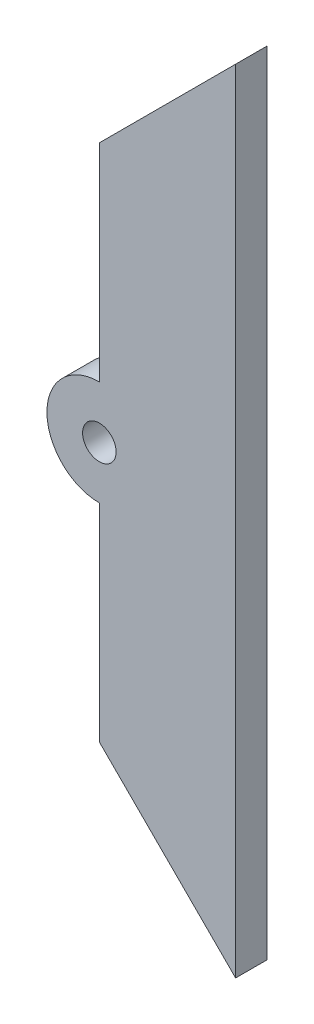
ISO-10303-21;
HEADER;
FILE_DESCRIPTION(('STEP AP214'),'2;1');
FILE_NAME('part.step','',(''),(''),'','','');
FILE_SCHEMA(('AUTOMOTIVE_DESIGN { 1 0 10303 214 1 1 1 1 }'));
ENDSEC;
DATA;
#1=APPLICATION_CONTEXT('core data for automotive mechanical design processes');
#2=APPLICATION_PROTOCOL_DEFINITION('international standard','automotive_design',2000,#1);
#3=PRODUCT_CONTEXT('',#1,'mechanical');
#4=PRODUCT('Part','Part','',(#3));
#5=PRODUCT_RELATED_PRODUCT_CATEGORY('part','',(#4));
#6=PRODUCT_DEFINITION_FORMATION('','',#4);
#7=PRODUCT_DEFINITION_CONTEXT('part definition',#1,'design');
#8=PRODUCT_DEFINITION('design','',#6,#7);
#9=PRODUCT_DEFINITION_SHAPE('','',#8);
#10=(LENGTH_UNIT() NAMED_UNIT(*) SI_UNIT(.MILLI.,.METRE.));
#11=(NAMED_UNIT(*) PLANE_ANGLE_UNIT() SI_UNIT($,.RADIAN.));
#12=(NAMED_UNIT(*) SI_UNIT($,.STERADIAN.) SOLID_ANGLE_UNIT());
#13=UNCERTAINTY_MEASURE_WITH_UNIT(LENGTH_MEASURE(1.E-05),#10,'distance_accuracy_value','');
#14=(GEOMETRIC_REPRESENTATION_CONTEXT(3) GLOBAL_UNCERTAINTY_ASSIGNED_CONTEXT((#13)) GLOBAL_UNIT_ASSIGNED_CONTEXT((#10,
#11,#12)) REPRESENTATION_CONTEXT('',''));
#15=CARTESIAN_POINT('',(0.,0.,0.));
#16=DIRECTION('',(0.,0.,1.));
#17=DIRECTION('',(1.,0.,0.));
#18=AXIS2_PLACEMENT_3D('',#15,#16,#17);
#19=CARTESIAN_POINT('',(-13.,0.,3.));
#20=DIRECTION('',(-1.,0.,0.));
#21=DIRECTION('',(0.,0.,1.));
#22=AXIS2_PLACEMENT_3D('',#19,#20,#21);
#23=PLANE('',#22);
#24=DIRECTION('',(0.,1.,0.));
#25=VECTOR('',#24,1.);
#26=CARTESIAN_POINT('',(-13.,0.,0.));
#27=LINE('',#26,#25);
#28=CARTESIAN_POINT('',(-13.,5.,0.));
#29=VERTEX_POINT('',#28);
#30=CARTESIAN_POINT('',(-13.,24.75,0.));
#31=VERTEX_POINT('',#30);
#32=EDGE_CURVE('E121',#29,#31,#27,.T.);
#33=ORIENTED_EDGE('',*,*,#32,.F.);
#34=DIRECTION('',(0.,0.,-1.));
#35=VECTOR('',#34,1.);
#36=CARTESIAN_POINT('',(-13.,5.,3.));
#37=LINE('',#36,#35);
#38=CARTESIAN_POINT('',(-13.,5.,3.));
#39=VERTEX_POINT('',#38);
#40=EDGE_CURVE('E11',#39,#29,#37,.T.);
#41=ORIENTED_EDGE('',*,*,#40,.F.);
#42=DIRECTION('',(0.,1.,0.));
#43=VECTOR('',#42,1.);
#44=CARTESIAN_POINT('',(-13.,0.,3.));
#45=LINE('',#44,#43);
#46=CARTESIAN_POINT('',(-13.,24.75,3.));
#47=VERTEX_POINT('',#46);
#48=EDGE_CURVE('E134',#39,#47,#45,.T.);
#49=ORIENTED_EDGE('',*,*,#48,.T.);
#50=DIRECTION('',(0.,0.,-1.));
#51=VECTOR('',#50,1.);
#52=CARTESIAN_POINT('',(-13.,24.75,3.));
#53=LINE('',#52,#51);
#54=EDGE_CURVE('E56',#47,#31,#53,.T.);
#55=ORIENTED_EDGE('',*,*,#54,.T.);
#56=EDGE_LOOP('',(#33,#41,#49,#55));
#57=FACE_BOUND('',#56,.T.);
#58=ADVANCED_FACE('F39',(#57),#23,.T.);
#59=CARTESIAN_POINT('',(-13.,0.,3.));
#60=DIRECTION('',(0.,0.,-1.));
#61=DIRECTION('',(-1.,0.,0.));
#62=AXIS2_PLACEMENT_3D('',#59,#60,#61);
#63=CYLINDRICAL_SURFACE('',#62,5.);
#64=CARTESIAN_POINT('',(-13.,0.,0.));
#65=DIRECTION('',(0.,0.,1.));
#66=DIRECTION('',(1.,0.,0.));
#67=AXIS2_PLACEMENT_3D('',#64,#65,#66);
#68=CIRCLE('',#67,5.);
#69=CARTESIAN_POINT('',(-13.,-5.,0.));
#70=VERTEX_POINT('',#69);
#71=EDGE_CURVE('E123',#29,#70,#68,.T.);
#72=ORIENTED_EDGE('',*,*,#71,.T.);
#73=DIRECTION('',(0.,0.,-1.));
#74=VECTOR('',#73,1.);
#75=CARTESIAN_POINT('',(-13.,-5.,3.));
#76=LINE('',#75,#74);
#77=CARTESIAN_POINT('',(-13.,-5.,3.));
#78=VERTEX_POINT('',#77);
#79=EDGE_CURVE('E48',#78,#70,#76,.T.);
#80=ORIENTED_EDGE('',*,*,#79,.F.);
#81=CARTESIAN_POINT('',(-13.,0.,3.));
#82=DIRECTION('',(0.,0.,1.));
#83=DIRECTION('',(1.,0.,0.));
#84=AXIS2_PLACEMENT_3D('',#81,#82,#83);
#85=CIRCLE('',#84,5.);
#86=EDGE_CURVE('E247',#39,#78,#85,.T.);
#87=ORIENTED_EDGE('',*,*,#86,.F.);
#88=ORIENTED_EDGE('',*,*,#40,.T.);
#89=EDGE_LOOP('',(#72,#80,#87,#88));
#90=FACE_BOUND('',#89,.T.);
#91=ADVANCED_FACE('F41',(#90),#63,.T.);
#92=CARTESIAN_POINT('',(-13.,-24.75,0.));
#93=VERTEX_POINT('',#92);
#94=EDGE_CURVE('E125',#93,#70,#27,.T.);
#95=ORIENTED_EDGE('',*,*,#94,.F.);
#96=DIRECTION('',(0.,0.,-1.));
#97=VECTOR('',#96,1.);
#98=CARTESIAN_POINT('',(-13.,-24.75,3.));
#99=LINE('',#98,#97);
#100=CARTESIAN_POINT('',(-13.,-24.75,3.));
#101=VERTEX_POINT('',#100);
#102=EDGE_CURVE('E113',#101,#93,#99,.T.);
#103=ORIENTED_EDGE('',*,*,#102,.F.);
#104=EDGE_CURVE('E103',#101,#78,#45,.T.);
#105=ORIENTED_EDGE('',*,*,#104,.T.);
#106=ORIENTED_EDGE('',*,*,#79,.T.);
#107=EDGE_LOOP('',(#95,#103,#105,#106));
#108=FACE_BOUND('',#107,.T.);
#109=ADVANCED_FACE('F140',(#108),#23,.T.);
#110=CARTESIAN_POINT('',(-18.8750000000001,-18.8749999999999,3.));
#111=DIRECTION('',(0.707106781186552,0.707106781186543,0.));
#112=DIRECTION('',(-0.707106781186543,0.707106781186552,0.));
#113=AXIS2_PLACEMENT_3D('',#110,#111,#112);
#114=PLANE('',#113);
#115=DIRECTION('',(0.707106781186543,-0.707106781186552,0.));
#116=VECTOR('',#115,1.);
#117=CARTESIAN_POINT('',(-18.8750000000001,-18.8749999999999,0.));
#118=LINE('',#117,#116);
#119=CARTESIAN_POINT('',(0.,-37.7500000000002,0.));
#120=VERTEX_POINT('',#119);
#121=EDGE_CURVE('E110',#93,#120,#118,.T.);
#122=ORIENTED_EDGE('',*,*,#121,.T.);
#123=DIRECTION('',(0.,0.,-1.));
#124=VECTOR('',#123,1.);
#125=CARTESIAN_POINT('',(0.,-37.7500000000002,3.));
#126=LINE('',#125,#124);
#127=CARTESIAN_POINT('',(0.,-37.7500000000002,3.));
#128=VERTEX_POINT('',#127);
#129=EDGE_CURVE('E107',#128,#120,#126,.T.);
#130=ORIENTED_EDGE('',*,*,#129,.F.);
#131=DIRECTION('',(0.707106781186543,-0.707106781186552,0.));
#132=VECTOR('',#131,1.);
#133=CARTESIAN_POINT('',(-18.8750000000001,-18.8749999999999,3.));
#134=LINE('',#133,#132);
#135=EDGE_CURVE('E95',#101,#128,#134,.T.);
#136=ORIENTED_EDGE('',*,*,#135,.F.);
#137=ORIENTED_EDGE('',*,*,#102,.T.);
#138=EDGE_LOOP('',(#122,#130,#136,#137));
#139=FACE_BOUND('',#138,.T.);
#140=ADVANCED_FACE('F108',(#139),#114,.F.);
#141=CARTESIAN_POINT('',(0.,0.,3.));
#142=DIRECTION('',(1.,0.,0.));
#143=DIRECTION('',(0.,0.,-1.));
#144=AXIS2_PLACEMENT_3D('',#141,#142,#143);
#145=PLANE('',#144);
#146=DIRECTION('',(0.,-1.,0.));
#147=VECTOR('',#146,1.);
#148=CARTESIAN_POINT('',(0.,0.,0.));
#149=LINE('',#148,#147);
#150=CARTESIAN_POINT('',(0.,37.7500000000002,0.));
#151=VERTEX_POINT('',#150);
#152=EDGE_CURVE('E129',#151,#120,#149,.T.);
#153=ORIENTED_EDGE('',*,*,#152,.F.);
#154=DIRECTION('',(0.,0.,-1.));
#155=VECTOR('',#154,1.);
#156=CARTESIAN_POINT('',(0.,37.7500000000002,3.));
#157=LINE('',#156,#155);
#158=CARTESIAN_POINT('',(0.,37.7500000000002,3.));
#159=VERTEX_POINT('',#158);
#160=EDGE_CURVE('E75',#159,#151,#157,.T.);
#161=ORIENTED_EDGE('',*,*,#160,.F.);
#162=DIRECTION('',(0.,-1.,0.));
#163=VECTOR('',#162,1.);
#164=CARTESIAN_POINT('',(0.,0.,3.));
#165=LINE('',#164,#163);
#166=EDGE_CURVE('E101',#159,#128,#165,.T.);
#167=ORIENTED_EDGE('',*,*,#166,.T.);
#168=ORIENTED_EDGE('',*,*,#129,.T.);
#169=EDGE_LOOP('',(#153,#161,#167,#168));
#170=FACE_BOUND('',#169,.T.);
#171=ADVANCED_FACE('F115',(#170),#145,.T.);
#172=CARTESIAN_POINT('',(-18.8750000000001,18.8749999999999,3.));
#173=DIRECTION('',(-0.707106781186552,0.707106781186543,0.));
#174=DIRECTION('',(-0.707106781186543,-0.707106781186552,0.));
#175=AXIS2_PLACEMENT_3D('',#172,#173,#174);
#176=PLANE('',#175);
#177=DIRECTION('',(0.707106781186543,0.707106781186552,0.));
#178=VECTOR('',#177,1.);
#179=CARTESIAN_POINT('',(-18.8750000000001,18.8749999999999,0.));
#180=LINE('',#179,#178);
#181=EDGE_CURVE('E131',#31,#151,#180,.T.);
#182=ORIENTED_EDGE('',*,*,#181,.F.);
#183=ORIENTED_EDGE('',*,*,#54,.F.);
#184=DIRECTION('',(0.707106781186543,0.707106781186552,0.));
#185=VECTOR('',#184,1.);
#186=CARTESIAN_POINT('',(-18.8750000000001,18.8749999999999,3.));
#187=LINE('',#186,#185);
#188=EDGE_CURVE('E116',#47,#159,#187,.T.);
#189=ORIENTED_EDGE('',*,*,#188,.T.);
#190=ORIENTED_EDGE('',*,*,#160,.T.);
#191=EDGE_LOOP('',(#182,#183,#189,#190));
#192=FACE_BOUND('',#191,.T.);
#193=ADVANCED_FACE('F146',(#192),#176,.T.);
#194=CARTESIAN_POINT('',(0.,0.,3.));
#195=DIRECTION('',(0.,0.,1.));
#196=DIRECTION('',(1.,0.,0.));
#197=AXIS2_PLACEMENT_3D('',#194,#195,#196);
#198=PLANE('',#197);
#199=CARTESIAN_POINT('',(-13.,0.,3.));
#200=DIRECTION('',(0.,0.,1.));
#201=DIRECTION('',(1.,0.,0.));
#202=AXIS2_PLACEMENT_3D('',#199,#200,#201);
#203=CIRCLE('',#202,1.6);
#204=CARTESIAN_POINT('',(-11.4,0.,3.));
#205=VERTEX_POINT('',#204);
#206=EDGE_CURVE('E241',#205,#205,#203,.T.);
#207=ORIENTED_EDGE('',*,*,#206,.F.);
#208=EDGE_LOOP('',(#207));
#209=FACE_BOUND('',#208,.T.);
#210=ORIENTED_EDGE('',*,*,#48,.F.);
#211=ORIENTED_EDGE('',*,*,#86,.T.);
#212=ORIENTED_EDGE('',*,*,#104,.F.);
#213=ORIENTED_EDGE('',*,*,#135,.T.);
#214=ORIENTED_EDGE('',*,*,#166,.F.);
#215=ORIENTED_EDGE('',*,*,#188,.F.);
#216=EDGE_LOOP('',(#210,#211,#212,#213,#214,#215));
#217=FACE_BOUND('',#216,.T.);
#218=ADVANCED_FACE('F98',(#209,#217),#198,.T.);
#219=CARTESIAN_POINT('',(0.,0.,0.));
#220=DIRECTION('',(0.,0.,1.));
#221=DIRECTION('',(1.,0.,0.));
#222=AXIS2_PLACEMENT_3D('',#219,#220,#221);
#223=PLANE('',#222);
#224=CARTESIAN_POINT('',(-13.,0.,0.));
#225=DIRECTION('',(0.,0.,1.));
#226=DIRECTION('',(1.,0.,0.));
#227=AXIS2_PLACEMENT_3D('',#224,#225,#226);
#228=CIRCLE('',#227,1.6);
#229=CARTESIAN_POINT('',(-11.4,0.,0.));
#230=VERTEX_POINT('',#229);
#231=EDGE_CURVE('E124',#230,#230,#228,.F.);
#232=ORIENTED_EDGE('',*,*,#231,.F.);
#233=EDGE_LOOP('',(#232));
#234=FACE_BOUND('',#233,.T.);
#235=ORIENTED_EDGE('',*,*,#32,.T.);
#236=ORIENTED_EDGE('',*,*,#181,.T.);
#237=ORIENTED_EDGE('',*,*,#152,.T.);
#238=ORIENTED_EDGE('',*,*,#121,.F.);
#239=ORIENTED_EDGE('',*,*,#94,.T.);
#240=ORIENTED_EDGE('',*,*,#71,.F.);
#241=EDGE_LOOP('',(#235,#236,#237,#238,#239,#240));
#242=FACE_BOUND('',#241,.T.);
#243=ADVANCED_FACE('F145',(#234,#242),#223,.F.);
#244=CARTESIAN_POINT('',(-13.,0.,-0.00100000000000013));
#245=DIRECTION('',(0.,0.,1.));
#246=DIRECTION('',(1.,0.,0.));
#247=AXIS2_PLACEMENT_3D('',#244,#245,#246);
#248=CYLINDRICAL_SURFACE('',#247,1.6);
#249=CARTESIAN_POINT('',(-11.4,0.,3.));
#250=CARTESIAN_POINT('',(-11.4,0.,2.96875));
#251=CARTESIAN_POINT('',(-11.4,0.,2.9375));
#252=CARTESIAN_POINT('',(-11.4,0.,2.875));
#253=CARTESIAN_POINT('',(-11.4,0.,2.84375));
#254=CARTESIAN_POINT('',(-11.4,0.,2.78125));
#255=CARTESIAN_POINT('',(-11.4,0.,2.75));
#256=CARTESIAN_POINT('',(-11.4,0.,2.6875));
#257=CARTESIAN_POINT('',(-11.4,0.,2.65625));
#258=CARTESIAN_POINT('',(-11.4,0.,2.59375));
#259=CARTESIAN_POINT('',(-11.4,0.,2.5625));
#260=CARTESIAN_POINT('',(-11.4,0.,2.5));
#261=CARTESIAN_POINT('',(-11.4,0.,2.46875));
#262=CARTESIAN_POINT('',(-11.4,0.,2.40625));
#263=CARTESIAN_POINT('',(-11.4,0.,2.375));
#264=CARTESIAN_POINT('',(-11.4,0.,2.3125));
#265=CARTESIAN_POINT('',(-11.4,0.,2.28125));
#266=CARTESIAN_POINT('',(-11.4,0.,2.21875));
#267=CARTESIAN_POINT('',(-11.4,0.,2.1875));
#268=CARTESIAN_POINT('',(-11.4,0.,2.125));
#269=CARTESIAN_POINT('',(-11.4,0.,2.09375));
#270=CARTESIAN_POINT('',(-11.4,0.,2.03125));
#271=CARTESIAN_POINT('',(-11.4,0.,2.));
#272=CARTESIAN_POINT('',(-11.4,0.,1.9375));
#273=CARTESIAN_POINT('',(-11.4,0.,1.90625));
#274=CARTESIAN_POINT('',(-11.4,0.,1.84375));
#275=CARTESIAN_POINT('',(-11.4,0.,1.8125));
#276=CARTESIAN_POINT('',(-11.4,0.,1.75));
#277=CARTESIAN_POINT('',(-11.4,0.,1.71875));
#278=CARTESIAN_POINT('',(-11.4,0.,1.65625));
#279=CARTESIAN_POINT('',(-11.4,0.,1.625));
#280=CARTESIAN_POINT('',(-11.4,0.,1.5625));
#281=CARTESIAN_POINT('',(-11.4,0.,1.53125));
#282=CARTESIAN_POINT('',(-11.4,0.,1.46875));
#283=CARTESIAN_POINT('',(-11.4,0.,1.4375));
#284=CARTESIAN_POINT('',(-11.4,0.,1.375));
#285=CARTESIAN_POINT('',(-11.4,0.,1.34375));
#286=CARTESIAN_POINT('',(-11.4,0.,1.28125));
#287=CARTESIAN_POINT('',(-11.4,0.,1.25));
#288=CARTESIAN_POINT('',(-11.4,0.,1.1875));
#289=CARTESIAN_POINT('',(-11.4,0.,1.15625));
#290=CARTESIAN_POINT('',(-11.4,0.,1.09375));
#291=CARTESIAN_POINT('',(-11.4,0.,1.0625));
#292=CARTESIAN_POINT('',(-11.4,0.,1.));
#293=CARTESIAN_POINT('',(-11.4,0.,0.96875));
#294=CARTESIAN_POINT('',(-11.4,0.,0.90625));
#295=CARTESIAN_POINT('',(-11.4,0.,0.875));
#296=CARTESIAN_POINT('',(-11.4,0.,0.8125));
#297=CARTESIAN_POINT('',(-11.4,0.,0.78125));
#298=CARTESIAN_POINT('',(-11.4,0.,0.71875));
#299=CARTESIAN_POINT('',(-11.4,0.,0.6875));
#300=CARTESIAN_POINT('',(-11.4,0.,0.625));
#301=CARTESIAN_POINT('',(-11.4,0.,0.59375));
#302=CARTESIAN_POINT('',(-11.4,0.,0.53125));
#303=CARTESIAN_POINT('',(-11.4,0.,0.5));
#304=CARTESIAN_POINT('',(-11.4,0.,0.4375));
#305=CARTESIAN_POINT('',(-11.4,0.,0.40625));
#306=CARTESIAN_POINT('',(-11.4,0.,0.34375));
#307=CARTESIAN_POINT('',(-11.4,0.,0.3125));
#308=CARTESIAN_POINT('',(-11.4,0.,0.25));
#309=CARTESIAN_POINT('',(-11.4,0.,0.21875));
#310=CARTESIAN_POINT('',(-11.4,0.,0.15625));
#311=CARTESIAN_POINT('',(-11.4,0.,0.125));
#312=CARTESIAN_POINT('',(-11.4,0.,0.0625000000000001));
#313=CARTESIAN_POINT('',(-11.4,0.,0.0312500000000001));
#314=CARTESIAN_POINT('',(-11.4,0.,0.));
#315=B_SPLINE_CURVE_WITH_KNOTS('',3,(#249,#250,#251,#252,#253,#254,#255,#256,#257,#258,#259,
#260,#261,#262,#263,#264,#265,#266,#267,#268,#269,#270,#271,#272,#273,#274,#275,#276,#277,#278,
#279,#280,#281,#282,#283,#284,#285,#286,#287,#288,#289,#290,#291,#292,#293,#294,#295,#296,#297,
#298,#299,#300,#301,#302,#303,#304,#305,#306,#307,#308,#309,#310,#311,#312,#313,#314),
.UNSPECIFIED.,.F.,.F.,(4,2,2,2,2,2,2,2,2,2,2,2,2,2,2,2,2,2,2,2,2,2,2,2,2,2,2,2,2,2,2,2,4),(0.,
0.0937500000000001,0.1875,0.28125,0.375,0.46875,0.5625,0.65625,0.75,0.84375,0.9375,1.03125,
1.125,1.21875,1.3125,1.40625,1.5,1.59375,1.6875,1.78125,1.875,1.96875,2.0625,2.15625,2.25,
2.34375,2.4375,2.53125,2.625,2.71875,2.8125,2.90625,3.),.UNSPECIFIED.);
#316=EDGE_CURVE('BSEAM194',#205,#230,#315,.T.);
#317=ORIENTED_EDGE('',*,*,#206,.T.);
#318=ORIENTED_EDGE('',*,*,#231,.T.);
#319=ORIENTED_EDGE('',*,*,#316,.T.);
#320=ORIENTED_EDGE('',*,*,#316,.F.);
#321=EDGE_LOOP('',(#317,#319,#318,#320));
#322=FACE_BOUND('',#321,.T.);
#323=ADVANCED_FACE('F194',(#322),#248,.F.);
#324=CLOSED_SHELL('',(#58,#91,#109,#140,#171,#193,#218,#243,#323));
#325=MANIFOLD_SOLID_BREP('B2',#324);
#326=ADVANCED_BREP_SHAPE_REPRESENTATION('',(#18,#325),#14);
#327=SHAPE_DEFINITION_REPRESENTATION(#9,#326);
ENDSEC;
END-ISO-10303-21;
